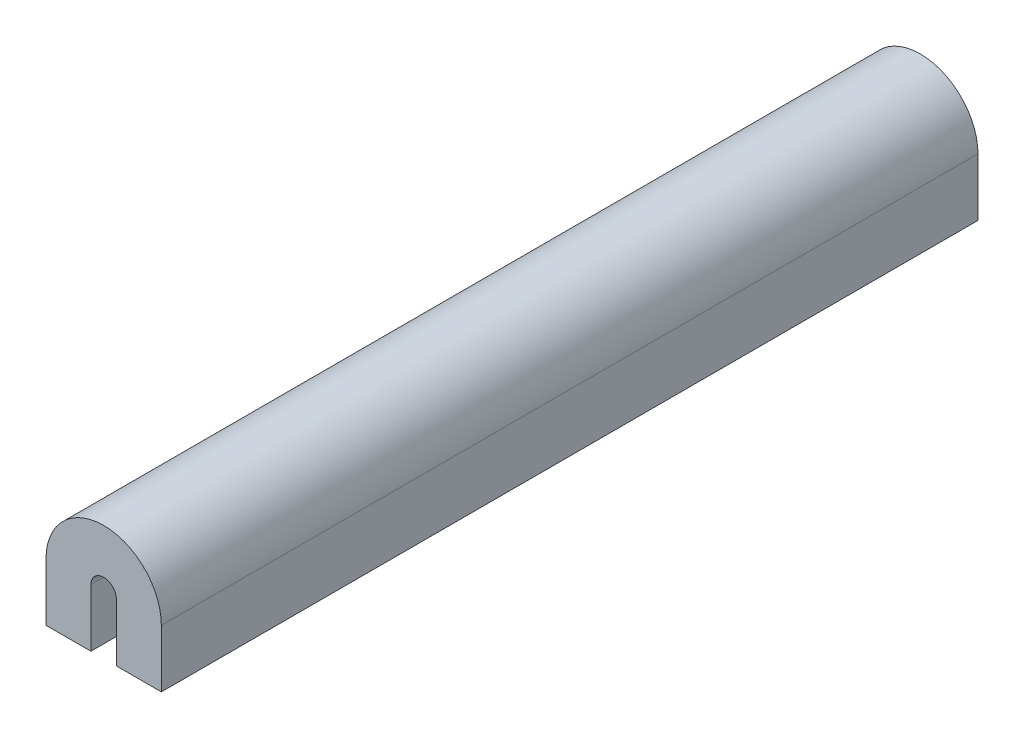
ISO-10303-21;
HEADER;
FILE_DESCRIPTION(('STEP AP214'),'2;1');
FILE_NAME('part.step','',(''),(''),'','','');
FILE_SCHEMA(('AUTOMOTIVE_DESIGN { 1 0 10303 214 1 1 1 1 }'));
ENDSEC;
DATA;
#1=APPLICATION_CONTEXT('core data for automotive mechanical design processes');
#2=APPLICATION_PROTOCOL_DEFINITION('international standard','automotive_design',2000,#1);
#3=PRODUCT_CONTEXT('',#1,'mechanical');
#4=PRODUCT('Part','Part','',(#3));
#5=PRODUCT_RELATED_PRODUCT_CATEGORY('part','',(#4));
#6=PRODUCT_DEFINITION_FORMATION('','',#4);
#7=PRODUCT_DEFINITION_CONTEXT('part definition',#1,'design');
#8=PRODUCT_DEFINITION('design','',#6,#7);
#9=PRODUCT_DEFINITION_SHAPE('','',#8);
#10=(LENGTH_UNIT() NAMED_UNIT(*) SI_UNIT(.MILLI.,.METRE.));
#11=(NAMED_UNIT(*) PLANE_ANGLE_UNIT() SI_UNIT($,.RADIAN.));
#12=(NAMED_UNIT(*) SI_UNIT($,.STERADIAN.) SOLID_ANGLE_UNIT());
#13=UNCERTAINTY_MEASURE_WITH_UNIT(LENGTH_MEASURE(1.E-05),#10,'distance_accuracy_value','');
#14=(GEOMETRIC_REPRESENTATION_CONTEXT(3) GLOBAL_UNCERTAINTY_ASSIGNED_CONTEXT((#13)) GLOBAL_UNIT_ASSIGNED_CONTEXT((#10,
#11,#12)) REPRESENTATION_CONTEXT('',''));
#15=CARTESIAN_POINT('',(0.,0.,0.));
#16=DIRECTION('',(0.,0.,1.));
#17=DIRECTION('',(1.,0.,0.));
#18=AXIS2_PLACEMENT_3D('',#15,#16,#17);
#19=CARTESIAN_POINT('',(0.,0.,101.6));
#20=DIRECTION('',(0.,0.,-1.));
#21=DIRECTION('',(-1.,0.,0.));
#22=AXIS2_PLACEMENT_3D('',#19,#20,#21);
#23=CYLINDRICAL_SURFACE('',#22,1.5875);
#24=CARTESIAN_POINT('',(0.,0.,0.));
#25=DIRECTION('',(0.,0.,-1.));
#26=DIRECTION('',(1.,0.,0.));
#27=AXIS2_PLACEMENT_3D('',#24,#25,#26);
#28=CIRCLE('',#27,1.5875);
#29=CARTESIAN_POINT('',(-1.5875,0.,0.));
#30=VERTEX_POINT('',#29);
#31=CARTESIAN_POINT('',(1.5875,0.,0.));
#32=VERTEX_POINT('',#31);
#33=EDGE_CURVE('E132',#30,#32,#28,.T.);
#34=ORIENTED_EDGE('',*,*,#33,.T.);
#35=DIRECTION('',(0.,0.,-1.));
#36=VECTOR('',#35,1.);
#37=CARTESIAN_POINT('',(1.5875,0.,101.6));
#38=LINE('',#37,#36);
#39=CARTESIAN_POINT('',(1.5875,0.,101.6));
#40=VERTEX_POINT('',#39);
#41=EDGE_CURVE('E11',#40,#32,#38,.T.);
#42=ORIENTED_EDGE('',*,*,#41,.F.);
#43=CARTESIAN_POINT('',(0.,0.,101.6));
#44=DIRECTION('',(0.,0.,-1.));
#45=DIRECTION('',(1.,0.,0.));
#46=AXIS2_PLACEMENT_3D('',#43,#44,#45);
#47=CIRCLE('',#46,1.5875);
#48=CARTESIAN_POINT('',(-1.5875,0.,101.6));
#49=VERTEX_POINT('',#48);
#50=EDGE_CURVE('E146',#49,#40,#47,.T.);
#51=ORIENTED_EDGE('',*,*,#50,.F.);
#52=DIRECTION('',(0.,0.,-1.));
#53=VECTOR('',#52,1.);
#54=CARTESIAN_POINT('',(-1.5875,0.,101.6));
#55=LINE('',#54,#53);
#56=EDGE_CURVE('E128',#49,#30,#55,.T.);
#57=ORIENTED_EDGE('',*,*,#56,.T.);
#58=EDGE_LOOP('',(#34,#42,#51,#57));
#59=FACE_BOUND('',#58,.T.);
#60=ADVANCED_FACE('F36',(#59),#23,.F.);
#61=CARTESIAN_POINT('',(1.5875,0.,101.6));
#62=DIRECTION('',(1.,0.,0.));
#63=DIRECTION('',(0.,0.,-1.));
#64=AXIS2_PLACEMENT_3D('',#61,#62,#63);
#65=PLANE('',#64);
#66=DIRECTION('',(0.,-1.,0.));
#67=VECTOR('',#66,1.);
#68=CARTESIAN_POINT('',(1.5875,0.,0.));
#69=LINE('',#68,#67);
#70=CARTESIAN_POINT('',(1.5875,-7.1755,0.));
#71=VERTEX_POINT('',#70);
#72=EDGE_CURVE('E135',#32,#71,#69,.T.);
#73=ORIENTED_EDGE('',*,*,#72,.T.);
#74=DIRECTION('',(0.,0.,-1.));
#75=VECTOR('',#74,1.);
#76=CARTESIAN_POINT('',(1.5875,-7.1755,101.6));
#77=LINE('',#76,#75);
#78=CARTESIAN_POINT('',(1.5875,-7.1755,101.6));
#79=VERTEX_POINT('',#78);
#80=EDGE_CURVE('E44',#79,#71,#77,.T.);
#81=ORIENTED_EDGE('',*,*,#80,.F.);
#82=DIRECTION('',(0.,-1.,0.));
#83=VECTOR('',#82,1.);
#84=CARTESIAN_POINT('',(1.5875,0.,101.6));
#85=LINE('',#84,#83);
#86=EDGE_CURVE('E95',#40,#79,#85,.T.);
#87=ORIENTED_EDGE('',*,*,#86,.F.);
#88=ORIENTED_EDGE('',*,*,#41,.T.);
#89=EDGE_LOOP('',(#73,#81,#87,#88));
#90=FACE_BOUND('',#89,.T.);
#91=ADVANCED_FACE('F181',(#90),#65,.F.);
#92=CARTESIAN_POINT('',(7.1755,-7.1755,101.6));
#93=DIRECTION('',(0.,1.,0.));
#94=DIRECTION('',(-1.,0.,0.));
#95=AXIS2_PLACEMENT_3D('',#92,#93,#94);
#96=PLANE('',#95);
#97=DIRECTION('',(1.,0.,0.));
#98=VECTOR('',#97,1.);
#99=CARTESIAN_POINT('',(7.1755,-7.1755,0.));
#100=LINE('',#99,#98);
#101=CARTESIAN_POINT('',(7.1755,-7.1755,0.));
#102=VERTEX_POINT('',#101);
#103=EDGE_CURVE('E137',#71,#102,#100,.T.);
#104=ORIENTED_EDGE('',*,*,#103,.T.);
#105=DIRECTION('',(0.,0.,-1.));
#106=VECTOR('',#105,1.);
#107=CARTESIAN_POINT('',(7.1755,-7.1755,101.6));
#108=LINE('',#107,#106);
#109=CARTESIAN_POINT('',(7.1755,-7.1755,101.6));
#110=VERTEX_POINT('',#109);
#111=EDGE_CURVE('E153',#110,#102,#108,.T.);
#112=ORIENTED_EDGE('',*,*,#111,.F.);
#113=DIRECTION('',(1.,0.,0.));
#114=VECTOR('',#113,1.);
#115=CARTESIAN_POINT('',(7.1755,-7.1755,101.6));
#116=LINE('',#115,#114);
#117=EDGE_CURVE('E161',#79,#110,#116,.T.);
#118=ORIENTED_EDGE('',*,*,#117,.F.);
#119=ORIENTED_EDGE('',*,*,#80,.T.);
#120=EDGE_LOOP('',(#104,#112,#118,#119));
#121=FACE_BOUND('',#120,.T.);
#122=ADVANCED_FACE('F159',(#121),#96,.F.);
#123=CARTESIAN_POINT('',(7.1755,0.,101.6));
#124=DIRECTION('',(-1.,0.,0.));
#125=DIRECTION('',(0.,-1.,0.));
#126=AXIS2_PLACEMENT_3D('',#123,#124,#125);
#127=PLANE('',#126);
#128=DIRECTION('',(0.,1.,0.));
#129=VECTOR('',#128,1.);
#130=CARTESIAN_POINT('',(7.1755,0.,0.));
#131=LINE('',#130,#129);
#132=CARTESIAN_POINT('',(7.1755,0.,0.));
#133=VERTEX_POINT('',#132);
#134=EDGE_CURVE('E139',#102,#133,#131,.T.);
#135=ORIENTED_EDGE('',*,*,#134,.T.);
#136=DIRECTION('',(0.,0.,-1.));
#137=VECTOR('',#136,1.);
#138=CARTESIAN_POINT('',(7.1755,0.,101.6));
#139=LINE('',#138,#137);
#140=CARTESIAN_POINT('',(7.1755,0.,101.6));
#141=VERTEX_POINT('',#140);
#142=EDGE_CURVE('E150',#141,#133,#139,.T.);
#143=ORIENTED_EDGE('',*,*,#142,.F.);
#144=DIRECTION('',(0.,1.,0.));
#145=VECTOR('',#144,1.);
#146=CARTESIAN_POINT('',(7.1755,0.,101.6));
#147=LINE('',#146,#145);
#148=EDGE_CURVE('E173',#110,#141,#147,.T.);
#149=ORIENTED_EDGE('',*,*,#148,.F.);
#150=ORIENTED_EDGE('',*,*,#111,.T.);
#151=EDGE_LOOP('',(#135,#143,#149,#150));
#152=FACE_BOUND('',#151,.T.);
#153=ADVANCED_FACE('F169',(#152),#127,.F.);
#154=CARTESIAN_POINT('',(0.,0.,101.6));
#155=DIRECTION('',(0.,0.,-1.));
#156=DIRECTION('',(-1.,0.,0.));
#157=AXIS2_PLACEMENT_3D('',#154,#155,#156);
#158=CYLINDRICAL_SURFACE('',#157,7.1755);
#159=CARTESIAN_POINT('',(0.,0.,0.));
#160=DIRECTION('',(0.,0.,1.));
#161=DIRECTION('',(1.,0.,0.));
#162=AXIS2_PLACEMENT_3D('',#159,#160,#161);
#163=CIRCLE('',#162,7.1755);
#164=CARTESIAN_POINT('',(-7.1755,0.,0.));
#165=VERTEX_POINT('',#164);
#166=EDGE_CURVE('E141',#133,#165,#163,.T.);
#167=ORIENTED_EDGE('',*,*,#166,.T.);
#168=DIRECTION('',(0.,0.,-1.));
#169=VECTOR('',#168,1.);
#170=CARTESIAN_POINT('',(-7.1755,0.,101.6));
#171=LINE('',#170,#169);
#172=CARTESIAN_POINT('',(-7.1755,0.,101.6));
#173=VERTEX_POINT('',#172);
#174=EDGE_CURVE('E123',#173,#165,#171,.T.);
#175=ORIENTED_EDGE('',*,*,#174,.F.);
#176=CARTESIAN_POINT('',(0.,0.,101.6));
#177=DIRECTION('',(0.,0.,1.));
#178=DIRECTION('',(1.,0.,0.));
#179=AXIS2_PLACEMENT_3D('',#176,#177,#178);
#180=CIRCLE('',#179,7.1755);
#181=EDGE_CURVE('E114',#141,#173,#180,.T.);
#182=ORIENTED_EDGE('',*,*,#181,.F.);
#183=ORIENTED_EDGE('',*,*,#142,.T.);
#184=EDGE_LOOP('',(#167,#175,#182,#183));
#185=FACE_BOUND('',#184,.T.);
#186=ADVANCED_FACE('F172',(#185),#158,.T.);
#187=CARTESIAN_POINT('',(-7.1755,0.,101.6));
#188=DIRECTION('',(1.,0.,0.));
#189=DIRECTION('',(0.,1.,0.));
#190=AXIS2_PLACEMENT_3D('',#187,#188,#189);
#191=PLANE('',#190);
#192=DIRECTION('',(0.,-1.,0.));
#193=VECTOR('',#192,1.);
#194=CARTESIAN_POINT('',(-7.1755,0.,0.));
#195=LINE('',#194,#193);
#196=CARTESIAN_POINT('',(-7.1755,-7.1755,0.));
#197=VERTEX_POINT('',#196);
#198=EDGE_CURVE('E122',#165,#197,#195,.T.);
#199=ORIENTED_EDGE('',*,*,#198,.T.);
#200=DIRECTION('',(0.,0.,-1.));
#201=VECTOR('',#200,1.);
#202=CARTESIAN_POINT('',(-7.1755,-7.1755,101.6));
#203=LINE('',#202,#201);
#204=CARTESIAN_POINT('',(-7.1755,-7.1755,101.6));
#205=VERTEX_POINT('',#204);
#206=EDGE_CURVE('E119',#205,#197,#203,.T.);
#207=ORIENTED_EDGE('',*,*,#206,.F.);
#208=DIRECTION('',(0.,-1.,0.));
#209=VECTOR('',#208,1.);
#210=CARTESIAN_POINT('',(-7.1755,0.,101.6));
#211=LINE('',#210,#209);
#212=EDGE_CURVE('E108',#173,#205,#211,.T.);
#213=ORIENTED_EDGE('',*,*,#212,.F.);
#214=ORIENTED_EDGE('',*,*,#174,.T.);
#215=EDGE_LOOP('',(#199,#207,#213,#214));
#216=FACE_BOUND('',#215,.T.);
#217=ADVANCED_FACE('F120',(#216),#191,.F.);
#218=CARTESIAN_POINT('',(-7.1755,-7.1755,101.6));
#219=DIRECTION('',(0.,1.,0.));
#220=DIRECTION('',(-1.,0.,0.));
#221=AXIS2_PLACEMENT_3D('',#218,#219,#220);
#222=PLANE('',#221);
#223=DIRECTION('',(1.,0.,0.));
#224=VECTOR('',#223,1.);
#225=CARTESIAN_POINT('',(-7.1755,-7.1755,0.));
#226=LINE('',#225,#224);
#227=CARTESIAN_POINT('',(-1.5875,-7.1755,0.));
#228=VERTEX_POINT('',#227);
#229=EDGE_CURVE('E81',#197,#228,#226,.T.);
#230=ORIENTED_EDGE('',*,*,#229,.T.);
#231=DIRECTION('',(0.,0.,-1.));
#232=VECTOR('',#231,1.);
#233=CARTESIAN_POINT('',(-1.5875,-7.1755,101.6));
#234=LINE('',#233,#232);
#235=CARTESIAN_POINT('',(-1.5875,-7.1755,101.6));
#236=VERTEX_POINT('',#235);
#237=EDGE_CURVE('E124',#236,#228,#234,.T.);
#238=ORIENTED_EDGE('',*,*,#237,.F.);
#239=DIRECTION('',(1.,0.,0.));
#240=VECTOR('',#239,1.);
#241=CARTESIAN_POINT('',(-7.1755,-7.1755,101.6));
#242=LINE('',#241,#240);
#243=EDGE_CURVE('E112',#205,#236,#242,.T.);
#244=ORIENTED_EDGE('',*,*,#243,.F.);
#245=ORIENTED_EDGE('',*,*,#206,.T.);
#246=EDGE_LOOP('',(#230,#238,#244,#245));
#247=FACE_BOUND('',#246,.T.);
#248=ADVANCED_FACE('F126',(#247),#222,.F.);
#249=CARTESIAN_POINT('',(-1.5875,0.,101.6));
#250=DIRECTION('',(-1.,0.,0.));
#251=DIRECTION('',(0.,0.,1.));
#252=AXIS2_PLACEMENT_3D('',#249,#250,#251);
#253=PLANE('',#252);
#254=DIRECTION('',(0.,1.,0.));
#255=VECTOR('',#254,1.);
#256=CARTESIAN_POINT('',(-1.5875,0.,0.));
#257=LINE('',#256,#255);
#258=EDGE_CURVE('E87',#228,#30,#257,.T.);
#259=ORIENTED_EDGE('',*,*,#258,.T.);
#260=ORIENTED_EDGE('',*,*,#56,.F.);
#261=DIRECTION('',(0.,1.,0.));
#262=VECTOR('',#261,1.);
#263=CARTESIAN_POINT('',(-1.5875,0.,101.6));
#264=LINE('',#263,#262);
#265=EDGE_CURVE('E52',#236,#49,#264,.T.);
#266=ORIENTED_EDGE('',*,*,#265,.F.);
#267=ORIENTED_EDGE('',*,*,#237,.T.);
#268=EDGE_LOOP('',(#259,#260,#266,#267));
#269=FACE_BOUND('',#268,.T.);
#270=ADVANCED_FACE('F197',(#269),#253,.F.);
#271=CARTESIAN_POINT('',(0.,0.,101.6));
#272=DIRECTION('',(0.,0.,1.));
#273=DIRECTION('',(1.,0.,0.));
#274=AXIS2_PLACEMENT_3D('',#271,#272,#273);
#275=PLANE('',#274);
#276=ORIENTED_EDGE('',*,*,#50,.T.);
#277=ORIENTED_EDGE('',*,*,#86,.T.);
#278=ORIENTED_EDGE('',*,*,#117,.T.);
#279=ORIENTED_EDGE('',*,*,#148,.T.);
#280=ORIENTED_EDGE('',*,*,#181,.T.);
#281=ORIENTED_EDGE('',*,*,#212,.T.);
#282=ORIENTED_EDGE('',*,*,#243,.T.);
#283=ORIENTED_EDGE('',*,*,#265,.T.);
#284=EDGE_LOOP('',(#276,#277,#278,#279,#280,#281,#282,#283));
#285=FACE_BOUND('',#284,.T.);
#286=ADVANCED_FACE('F110',(#285),#275,.T.);
#287=CARTESIAN_POINT('',(0.,0.,0.));
#288=DIRECTION('',(0.,0.,1.));
#289=DIRECTION('',(1.,0.,0.));
#290=AXIS2_PLACEMENT_3D('',#287,#288,#289);
#291=PLANE('',#290);
#292=ORIENTED_EDGE('',*,*,#33,.F.);
#293=ORIENTED_EDGE('',*,*,#258,.F.);
#294=ORIENTED_EDGE('',*,*,#229,.F.);
#295=ORIENTED_EDGE('',*,*,#198,.F.);
#296=ORIENTED_EDGE('',*,*,#166,.F.);
#297=ORIENTED_EDGE('',*,*,#134,.F.);
#298=ORIENTED_EDGE('',*,*,#103,.F.);
#299=ORIENTED_EDGE('',*,*,#72,.F.);
#300=EDGE_LOOP('',(#292,#293,#294,#295,#296,#297,#298,#299));
#301=FACE_BOUND('',#300,.T.);
#302=ADVANCED_FACE('F165',(#301),#291,.F.);
#303=CLOSED_SHELL('',(#60,#91,#122,#153,#186,#217,#248,#270,#286,#302));
#304=MANIFOLD_SOLID_BREP('B2',#303);
#305=ADVANCED_BREP_SHAPE_REPRESENTATION('',(#18,#304),#14);
#306=SHAPE_DEFINITION_REPRESENTATION(#9,#305);
ENDSEC;
END-ISO-10303-21;
